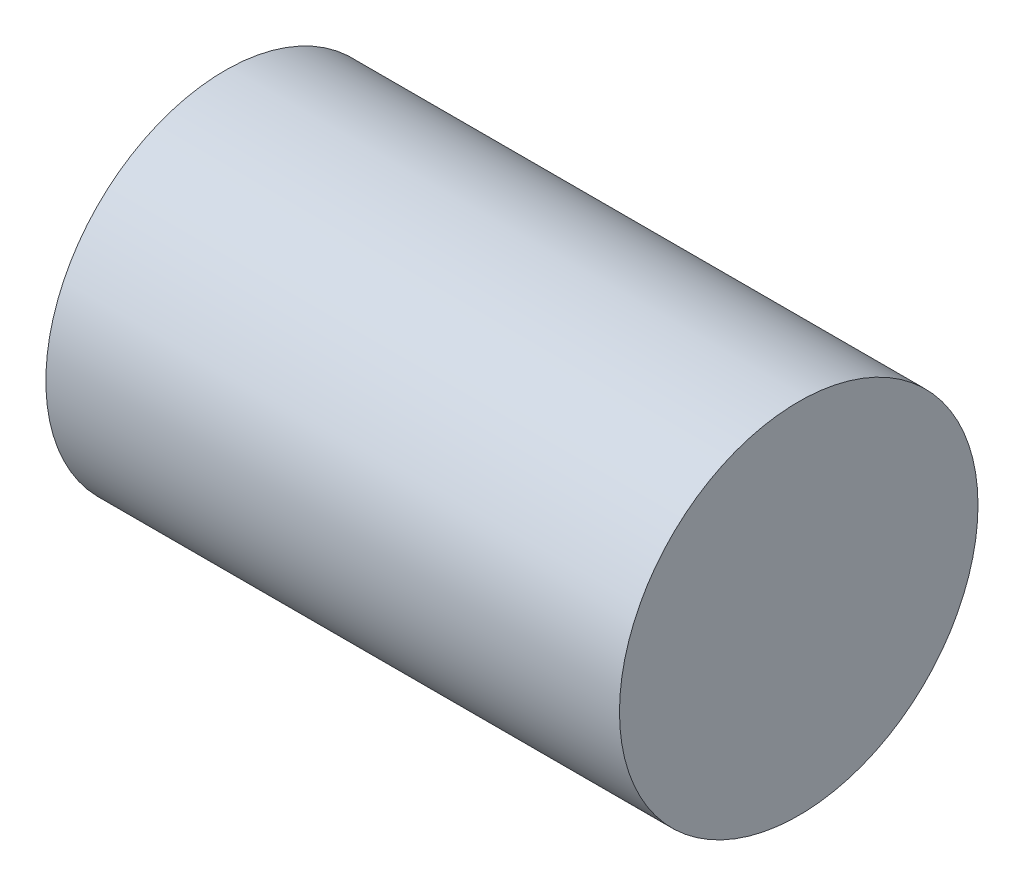
ISO-10303-21;
HEADER;
FILE_DESCRIPTION(('STEP AP214'),'2;1');
FILE_NAME('part.step','',(''),(''),'','','');
FILE_SCHEMA(('AUTOMOTIVE_DESIGN { 1 0 10303 214 1 1 1 1 }'));
ENDSEC;
DATA;
#1=APPLICATION_CONTEXT('core data for automotive mechanical design processes');
#2=APPLICATION_PROTOCOL_DEFINITION('international standard','automotive_design',2000,#1);
#3=PRODUCT_CONTEXT('',#1,'mechanical');
#4=PRODUCT('Part','Part','',(#3));
#5=PRODUCT_RELATED_PRODUCT_CATEGORY('part','',(#4));
#6=PRODUCT_DEFINITION_FORMATION('','',#4);
#7=PRODUCT_DEFINITION_CONTEXT('part definition',#1,'design');
#8=PRODUCT_DEFINITION('design','',#6,#7);
#9=PRODUCT_DEFINITION_SHAPE('','',#8);
#10=(LENGTH_UNIT() NAMED_UNIT(*) SI_UNIT(.MILLI.,.METRE.));
#11=(NAMED_UNIT(*) PLANE_ANGLE_UNIT() SI_UNIT($,.RADIAN.));
#12=(NAMED_UNIT(*) SI_UNIT($,.STERADIAN.) SOLID_ANGLE_UNIT());
#13=UNCERTAINTY_MEASURE_WITH_UNIT(LENGTH_MEASURE(1.E-05),#10,'distance_accuracy_value','');
#14=(GEOMETRIC_REPRESENTATION_CONTEXT(3) GLOBAL_UNCERTAINTY_ASSIGNED_CONTEXT((#13)) GLOBAL_UNIT_ASSIGNED_CONTEXT((#10,
#11,#12)) REPRESENTATION_CONTEXT('',''));
#15=CARTESIAN_POINT('',(0.,0.,0.));
#16=DIRECTION('',(0.,0.,1.));
#17=DIRECTION('',(1.,0.,0.));
#18=AXIS2_PLACEMENT_3D('',#15,#16,#17);
#19=CARTESIAN_POINT('',(6.4,0.,0.));
#20=DIRECTION('',(1.,0.,0.));
#21=DIRECTION('',(0.,0.,-1.));
#22=AXIS2_PLACEMENT_3D('',#19,#20,#21);
#23=PLANE('',#22);
#24=CARTESIAN_POINT('',(6.4,0.,0.));
#25=DIRECTION('',(-1.,0.,0.));
#26=DIRECTION('',(0.,0.,1.));
#27=AXIS2_PLACEMENT_3D('',#24,#25,#26);
#28=CIRCLE('',#27,4.);
#29=CARTESIAN_POINT('',(6.4,0.,4.));
#30=VERTEX_POINT('',#29);
#31=EDGE_CURVE('E9',#30,#30,#28,.T.);
#32=ORIENTED_EDGE('',*,*,#31,.F.);
#33=EDGE_LOOP('',(#32));
#34=FACE_BOUND('',#33,.T.);
#35=ADVANCED_FACE('F14',(#34),#23,.T.);
#36=CARTESIAN_POINT('',(-6.4,0.,0.));
#37=DIRECTION('',(-1.,0.,0.));
#38=DIRECTION('',(0.,0.,1.));
#39=AXIS2_PLACEMENT_3D('',#36,#37,#38);
#40=PLANE('',#39);
#41=CARTESIAN_POINT('',(-6.4,0.,0.));
#42=DIRECTION('',(1.,0.,0.));
#43=DIRECTION('',(0.,0.,-1.));
#44=AXIS2_PLACEMENT_3D('',#41,#42,#43);
#45=CIRCLE('',#44,4.);
#46=CARTESIAN_POINT('',(-6.4,0.,-4.));
#47=VERTEX_POINT('',#46);
#48=EDGE_CURVE('E21',#47,#47,#45,.T.);
#49=ORIENTED_EDGE('',*,*,#48,.F.);
#50=EDGE_LOOP('',(#49));
#51=FACE_BOUND('',#50,.T.);
#52=ADVANCED_FACE('F28',(#51),#40,.T.);
#53=CARTESIAN_POINT('',(-6.4,0.,0.));
#54=DIRECTION('',(1.,0.,0.));
#55=DIRECTION('',(0.,0.,-1.));
#56=AXIS2_PLACEMENT_3D('',#53,#54,#55);
#57=CYLINDRICAL_SURFACE('',#56,4.);
#58=ORIENTED_EDGE('',*,*,#31,.T.);
#59=EDGE_LOOP('',(#58));
#60=FACE_BOUND('',#59,.T.);
#61=ORIENTED_EDGE('',*,*,#48,.T.);
#62=EDGE_LOOP('',(#61));
#63=FACE_BOUND('',#62,.T.);
#64=ADVANCED_FACE('F16',(#60,#63),#57,.T.);
#65=CLOSED_SHELL('',(#35,#52,#64));
#66=MANIFOLD_SOLID_BREP('B1',#65);
#67=ADVANCED_BREP_SHAPE_REPRESENTATION('',(#18,#66),#14);
#68=SHAPE_DEFINITION_REPRESENTATION(#9,#67);
ENDSEC;
END-ISO-10303-21;
